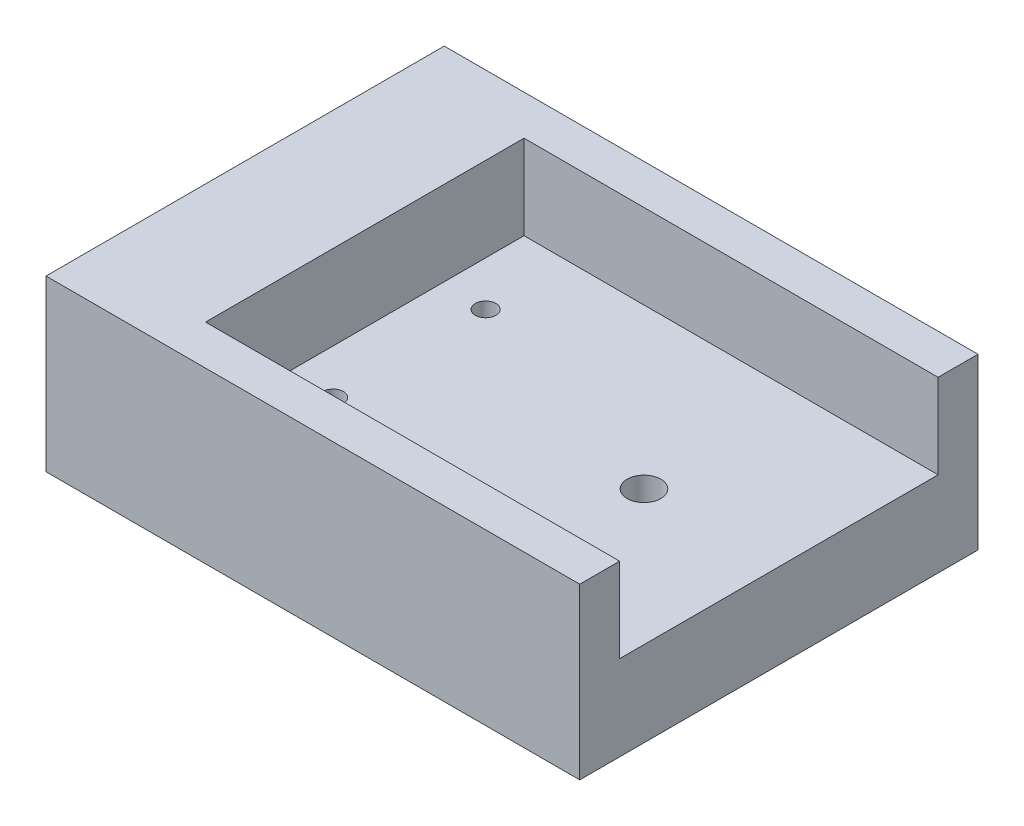
ISO-10303-21;
HEADER;
FILE_DESCRIPTION(('STEP AP214'),'2;1');
FILE_NAME('part.step','',(''),(''),'','','');
FILE_SCHEMA(('AUTOMOTIVE_DESIGN { 1 0 10303 214 1 1 1 1 }'));
ENDSEC;
DATA;
#1=APPLICATION_CONTEXT('core data for automotive mechanical design processes');
#2=APPLICATION_PROTOCOL_DEFINITION('international standard','automotive_design',2000,#1);
#3=PRODUCT_CONTEXT('',#1,'mechanical');
#4=PRODUCT('Part','Part','',(#3));
#5=PRODUCT_RELATED_PRODUCT_CATEGORY('part','',(#4));
#6=PRODUCT_DEFINITION_FORMATION('','',#4);
#7=PRODUCT_DEFINITION_CONTEXT('part definition',#1,'design');
#8=PRODUCT_DEFINITION('design','',#6,#7);
#9=PRODUCT_DEFINITION_SHAPE('','',#8);
#10=(LENGTH_UNIT() NAMED_UNIT(*) SI_UNIT(.MILLI.,.METRE.));
#11=(NAMED_UNIT(*) PLANE_ANGLE_UNIT() SI_UNIT($,.RADIAN.));
#12=(NAMED_UNIT(*) SI_UNIT($,.STERADIAN.) SOLID_ANGLE_UNIT());
#13=UNCERTAINTY_MEASURE_WITH_UNIT(LENGTH_MEASURE(1.E-05),#10,'distance_accuracy_value','');
#14=(GEOMETRIC_REPRESENTATION_CONTEXT(3) GLOBAL_UNCERTAINTY_ASSIGNED_CONTEXT((#13)) GLOBAL_UNIT_ASSIGNED_CONTEXT((#10,
#11,#12)) REPRESENTATION_CONTEXT('',''));
#15=CARTESIAN_POINT('',(0.,0.,0.));
#16=DIRECTION('',(0.,0.,1.));
#17=DIRECTION('',(1.,0.,0.));
#18=AXIS2_PLACEMENT_3D('',#15,#16,#17);
#19=CARTESIAN_POINT('',(45.5,28.9,-33.95));
#20=DIRECTION('',(-1.,0.,0.));
#21=DIRECTION('',(0.,0.,1.));
#22=AXIS2_PLACEMENT_3D('',#19,#20,#21);
#23=PLANE('',#22);
#24=DIRECTION('',(0.,0.,1.));
#25=VECTOR('',#24,1.);
#26=CARTESIAN_POINT('',(45.5,14.5,-27.15));
#27=LINE('',#26,#25);
#28=CARTESIAN_POINT('',(45.5,14.5,-27.15));
#29=VERTEX_POINT('',#28);
#30=CARTESIAN_POINT('',(45.5,14.5,27.15));
#31=VERTEX_POINT('',#30);
#32=EDGE_CURVE('E138',#29,#31,#27,.T.);
#33=ORIENTED_EDGE('',*,*,#32,.T.);
#34=DIRECTION('',(0.,1.,0.));
#35=VECTOR('',#34,1.);
#36=CARTESIAN_POINT('',(45.5,-89.0665481536138,27.15));
#37=LINE('',#36,#35);
#38=CARTESIAN_POINT('',(45.5,28.9,27.15));
#39=VERTEX_POINT('',#38);
#40=EDGE_CURVE('E130',#31,#39,#37,.T.);
#41=ORIENTED_EDGE('',*,*,#40,.T.);
#42=DIRECTION('',(0.,0.,-1.));
#43=VECTOR('',#42,1.);
#44=CARTESIAN_POINT('',(45.5,28.9,-33.95));
#45=LINE('',#44,#43);
#46=CARTESIAN_POINT('',(45.5,28.9,33.95));
#47=VERTEX_POINT('',#46);
#48=EDGE_CURVE('E139',#47,#39,#45,.T.);
#49=ORIENTED_EDGE('',*,*,#48,.F.);
#50=DIRECTION('',(0.,-1.,0.));
#51=VECTOR('',#50,1.);
#52=CARTESIAN_POINT('',(45.5,28.9,33.95));
#53=LINE('',#52,#51);
#54=CARTESIAN_POINT('',(45.5,0.,33.95));
#55=VERTEX_POINT('',#54);
#56=EDGE_CURVE('E146',#47,#55,#53,.T.);
#57=ORIENTED_EDGE('',*,*,#56,.T.);
#58=DIRECTION('',(0.,0.,-1.));
#59=VECTOR('',#58,1.);
#60=CARTESIAN_POINT('',(45.5,0.,-33.95));
#61=LINE('',#60,#59);
#62=CARTESIAN_POINT('',(45.5,0.,-33.95));
#63=VERTEX_POINT('',#62);
#64=EDGE_CURVE('E137',#55,#63,#61,.T.);
#65=ORIENTED_EDGE('',*,*,#64,.T.);
#66=DIRECTION('',(0.,-1.,0.));
#67=VECTOR('',#66,1.);
#68=CARTESIAN_POINT('',(45.5,28.9,-33.95));
#69=LINE('',#68,#67);
#70=CARTESIAN_POINT('',(45.5,28.9,-33.95));
#71=VERTEX_POINT('',#70);
#72=EDGE_CURVE('E12',#71,#63,#69,.T.);
#73=ORIENTED_EDGE('',*,*,#72,.F.);
#74=CARTESIAN_POINT('',(45.5,28.9,-27.15));
#75=VERTEX_POINT('',#74);
#76=EDGE_CURVE('E85',#75,#71,#45,.T.);
#77=ORIENTED_EDGE('',*,*,#76,.F.);
#78=DIRECTION('',(0.,1.,0.));
#79=VECTOR('',#78,1.);
#80=CARTESIAN_POINT('',(45.5,-89.0665481536138,-27.15));
#81=LINE('',#80,#79);
#82=EDGE_CURVE('E49',#29,#75,#81,.T.);
#83=ORIENTED_EDGE('',*,*,#82,.F.);
#84=EDGE_LOOP('',(#33,#41,#49,#57,#65,#73,#77,#83));
#85=FACE_BOUND('',#84,.T.);
#86=ADVANCED_FACE('F35',(#85),#23,.F.);
#87=CARTESIAN_POINT('',(-45.5,28.9,-33.95));
#88=DIRECTION('',(0.,0.,1.));
#89=DIRECTION('',(1.,0.,0.));
#90=AXIS2_PLACEMENT_3D('',#87,#88,#89);
#91=PLANE('',#90);
#92=DIRECTION('',(-1.,0.,0.));
#93=VECTOR('',#92,1.);
#94=CARTESIAN_POINT('',(-45.5,0.,-33.95));
#95=LINE('',#94,#93);
#96=CARTESIAN_POINT('',(-45.5,0.,-33.95));
#97=VERTEX_POINT('',#96);
#98=EDGE_CURVE('E149',#63,#97,#95,.T.);
#99=ORIENTED_EDGE('',*,*,#98,.T.);
#100=DIRECTION('',(0.,-1.,0.));
#101=VECTOR('',#100,1.);
#102=CARTESIAN_POINT('',(-45.5,28.9,-33.95));
#103=LINE('',#102,#101);
#104=CARTESIAN_POINT('',(-45.5,28.9,-33.95));
#105=VERTEX_POINT('',#104);
#106=EDGE_CURVE('E42',#105,#97,#103,.T.);
#107=ORIENTED_EDGE('',*,*,#106,.F.);
#108=DIRECTION('',(-1.,0.,0.));
#109=VECTOR('',#108,1.);
#110=CARTESIAN_POINT('',(-45.5,28.9,-33.95));
#111=LINE('',#110,#109);
#112=EDGE_CURVE('E141',#71,#105,#111,.T.);
#113=ORIENTED_EDGE('',*,*,#112,.F.);
#114=ORIENTED_EDGE('',*,*,#72,.T.);
#115=EDGE_LOOP('',(#99,#107,#113,#114));
#116=FACE_BOUND('',#115,.T.);
#117=ADVANCED_FACE('F179',(#116),#91,.F.);
#118=CARTESIAN_POINT('',(-45.5,28.9,-33.95));
#119=DIRECTION('',(1.,0.,0.));
#120=DIRECTION('',(0.,0.,-1.));
#121=AXIS2_PLACEMENT_3D('',#118,#119,#120);
#122=PLANE('',#121);
#123=CARTESIAN_POINT('',(-45.5,5.75039678785909,0.));
#124=DIRECTION('',(-1.,0.,0.));
#125=DIRECTION('',(0.,0.,1.));
#126=AXIS2_PLACEMENT_3D('',#123,#124,#125);
#127=CIRCLE('',#126,3.75);
#128=CARTESIAN_POINT('',(-45.5,5.75039678785909,3.75));
#129=VERTEX_POINT('',#128);
#130=EDGE_CURVE('E316',#129,#129,#127,.T.);
#131=ORIENTED_EDGE('',*,*,#130,.F.);
#132=EDGE_LOOP('',(#131));
#133=FACE_BOUND('',#132,.T.);
#134=DIRECTION('',(0.,0.,1.));
#135=VECTOR('',#134,1.);
#136=CARTESIAN_POINT('',(-45.5,0.,-33.95));
#137=LINE('',#136,#135);
#138=CARTESIAN_POINT('',(-45.5,0.,33.95));
#139=VERTEX_POINT('',#138);
#140=EDGE_CURVE('E151',#97,#139,#137,.T.);
#141=ORIENTED_EDGE('',*,*,#140,.T.);
#142=DIRECTION('',(0.,-1.,0.));
#143=VECTOR('',#142,1.);
#144=CARTESIAN_POINT('',(-45.5,28.9,33.95));
#145=LINE('',#144,#143);
#146=CARTESIAN_POINT('',(-45.5,28.9,33.95));
#147=VERTEX_POINT('',#146);
#148=EDGE_CURVE('E155',#147,#139,#145,.T.);
#149=ORIENTED_EDGE('',*,*,#148,.F.);
#150=DIRECTION('',(0.,0.,1.));
#151=VECTOR('',#150,1.);
#152=CARTESIAN_POINT('',(-45.5,28.9,-33.95));
#153=LINE('',#152,#151);
#154=EDGE_CURVE('E143',#105,#147,#153,.T.);
#155=ORIENTED_EDGE('',*,*,#154,.F.);
#156=ORIENTED_EDGE('',*,*,#106,.T.);
#157=EDGE_LOOP('',(#141,#149,#155,#156));
#158=FACE_BOUND('',#157,.T.);
#159=ADVANCED_FACE('F161',(#133,#158),#122,.F.);
#160=CARTESIAN_POINT('',(-45.5,28.9,33.95));
#161=DIRECTION('',(0.,0.,-1.));
#162=DIRECTION('',(-1.,0.,0.));
#163=AXIS2_PLACEMENT_3D('',#160,#161,#162);
#164=PLANE('',#163);
#165=DIRECTION('',(1.,0.,0.));
#166=VECTOR('',#165,1.);
#167=CARTESIAN_POINT('',(-45.5,0.,33.95));
#168=LINE('',#167,#166);
#169=EDGE_CURVE('E79',#139,#55,#168,.T.);
#170=ORIENTED_EDGE('',*,*,#169,.T.);
#171=ORIENTED_EDGE('',*,*,#56,.F.);
#172=DIRECTION('',(1.,0.,0.));
#173=VECTOR('',#172,1.);
#174=CARTESIAN_POINT('',(-45.5,28.9,33.95));
#175=LINE('',#174,#173);
#176=EDGE_CURVE('E58',#147,#47,#175,.T.);
#177=ORIENTED_EDGE('',*,*,#176,.F.);
#178=ORIENTED_EDGE('',*,*,#148,.T.);
#179=EDGE_LOOP('',(#170,#171,#177,#178));
#180=FACE_BOUND('',#179,.T.);
#181=ADVANCED_FACE('F171',(#180),#164,.F.);
#182=CARTESIAN_POINT('',(0.,28.9,0.));
#183=DIRECTION('',(0.,1.,0.));
#184=DIRECTION('',(0.,0.,1.));
#185=AXIS2_PLACEMENT_3D('',#182,#183,#184);
#186=PLANE('',#185);
#187=DIRECTION('',(1.,0.,0.));
#188=VECTOR('',#187,1.);
#189=CARTESIAN_POINT('',(-25.1,28.9,27.15));
#190=LINE('',#189,#188);
#191=CARTESIAN_POINT('',(-25.1,28.9,27.15));
#192=VERTEX_POINT('',#191);
#193=EDGE_CURVE('E125',#192,#39,#190,.T.);
#194=ORIENTED_EDGE('',*,*,#193,.F.);
#195=DIRECTION('',(0.,0.,1.));
#196=VECTOR('',#195,1.);
#197=CARTESIAN_POINT('',(-25.1,28.9,-27.15));
#198=LINE('',#197,#196);
#199=CARTESIAN_POINT('',(-25.1,28.9,-27.15));
#200=VERTEX_POINT('',#199);
#201=EDGE_CURVE('E113',#200,#192,#198,.T.);
#202=ORIENTED_EDGE('',*,*,#201,.F.);
#203=DIRECTION('',(-1.,0.,0.));
#204=VECTOR('',#203,1.);
#205=CARTESIAN_POINT('',(-25.1,28.9,-27.15));
#206=LINE('',#205,#204);
#207=EDGE_CURVE('E120',#75,#200,#206,.T.);
#208=ORIENTED_EDGE('',*,*,#207,.F.);
#209=ORIENTED_EDGE('',*,*,#76,.T.);
#210=ORIENTED_EDGE('',*,*,#112,.T.);
#211=ORIENTED_EDGE('',*,*,#154,.T.);
#212=ORIENTED_EDGE('',*,*,#176,.T.);
#213=ORIENTED_EDGE('',*,*,#48,.T.);
#214=EDGE_LOOP('',(#194,#202,#208,#209,#210,#211,#212,#213));
#215=FACE_BOUND('',#214,.T.);
#216=ADVANCED_FACE('F124',(#215),#186,.T.);
#217=CARTESIAN_POINT('',(0.,0.,0.));
#218=DIRECTION('',(0.,1.,0.));
#219=DIRECTION('',(0.,0.,1.));
#220=AXIS2_PLACEMENT_3D('',#217,#218,#219);
#221=PLANE('',#220);
#222=CARTESIAN_POINT('',(22.5,0.,0.));
#223=DIRECTION('',(0.,1.,0.));
#224=DIRECTION('',(0.,0.,1.));
#225=AXIS2_PLACEMENT_3D('',#222,#223,#224);
#226=CIRCLE('',#225,2.87151234494295);
#227=CARTESIAN_POINT('',(22.5,0.,2.87151234494295));
#228=VERTEX_POINT('',#227);
#229=EDGE_CURVE('E319',#228,#228,#226,.F.);
#230=ORIENTED_EDGE('',*,*,#229,.F.);
#231=EDGE_LOOP('',(#230));
#232=FACE_BOUND('',#231,.T.);
#233=CARTESIAN_POINT('',(-17.5,0.,-13.));
#234=DIRECTION('',(0.,1.,0.));
#235=DIRECTION('',(0.,0.,1.));
#236=AXIS2_PLACEMENT_3D('',#233,#234,#235);
#237=CIRCLE('',#236,1.75465885186677);
#238=CARTESIAN_POINT('',(-17.5,0.,-11.2453411481332));
#239=VERTEX_POINT('',#238);
#240=EDGE_CURVE('E329',#239,#239,#237,.F.);
#241=ORIENTED_EDGE('',*,*,#240,.F.);
#242=EDGE_LOOP('',(#241));
#243=FACE_BOUND('',#242,.T.);
#244=CARTESIAN_POINT('',(-17.5,0.,13.));
#245=DIRECTION('',(0.,1.,0.));
#246=DIRECTION('',(0.,0.,1.));
#247=AXIS2_PLACEMENT_3D('',#244,#245,#246);
#248=CIRCLE('',#247,1.75465885186677);
#249=CARTESIAN_POINT('',(-17.5,0.,14.7546588518668));
#250=VERTEX_POINT('',#249);
#251=EDGE_CURVE('E322',#250,#250,#248,.F.);
#252=ORIENTED_EDGE('',*,*,#251,.F.);
#253=EDGE_LOOP('',(#252));
#254=FACE_BOUND('',#253,.T.);
#255=ORIENTED_EDGE('',*,*,#64,.F.);
#256=ORIENTED_EDGE('',*,*,#169,.F.);
#257=ORIENTED_EDGE('',*,*,#140,.F.);
#258=ORIENTED_EDGE('',*,*,#98,.F.);
#259=EDGE_LOOP('',(#255,#256,#257,#258));
#260=FACE_BOUND('',#259,.T.);
#261=ADVANCED_FACE('F166',(#232,#243,#254,#260),#221,.F.);
#262=CARTESIAN_POINT('',(-25.1,-89.0665481536138,27.15));
#263=DIRECTION('',(0.,0.,1.));
#264=DIRECTION('',(1.,0.,0.));
#265=AXIS2_PLACEMENT_3D('',#262,#263,#264);
#266=PLANE('',#265);
#267=DIRECTION('',(-1.,0.,0.));
#268=VECTOR('',#267,1.);
#269=CARTESIAN_POINT('',(-25.1,14.5,27.15));
#270=LINE('',#269,#268);
#271=CARTESIAN_POINT('',(-25.1,14.5,27.15));
#272=VERTEX_POINT('',#271);
#273=EDGE_CURVE('E310',#31,#272,#270,.T.);
#274=ORIENTED_EDGE('',*,*,#273,.T.);
#275=DIRECTION('',(0.,1.,0.));
#276=VECTOR('',#275,1.);
#277=CARTESIAN_POINT('',(-25.1,-89.0665481536138,27.15));
#278=LINE('',#277,#276);
#279=EDGE_CURVE('E118',#272,#192,#278,.T.);
#280=ORIENTED_EDGE('',*,*,#279,.T.);
#281=ORIENTED_EDGE('',*,*,#193,.T.);
#282=ORIENTED_EDGE('',*,*,#40,.F.);
#283=EDGE_LOOP('',(#274,#280,#281,#282));
#284=FACE_BOUND('',#283,.T.);
#285=ADVANCED_FACE('F234',(#284),#266,.F.);
#286=CARTESIAN_POINT('',(-25.1,-89.0665481536138,-27.15));
#287=DIRECTION('',(-1.,0.,0.));
#288=DIRECTION('',(0.,0.,1.));
#289=AXIS2_PLACEMENT_3D('',#286,#287,#288);
#290=PLANE('',#289);
#291=DIRECTION('',(0.,0.,-1.));
#292=VECTOR('',#291,1.);
#293=CARTESIAN_POINT('',(-25.1,14.5,-27.15));
#294=LINE('',#293,#292);
#295=CARTESIAN_POINT('',(-25.1,14.5,-27.15));
#296=VERTEX_POINT('',#295);
#297=EDGE_CURVE('E116',#272,#296,#294,.T.);
#298=ORIENTED_EDGE('',*,*,#297,.T.);
#299=DIRECTION('',(0.,1.,0.));
#300=VECTOR('',#299,1.);
#301=CARTESIAN_POINT('',(-25.1,-89.0665481536138,-27.15));
#302=LINE('',#301,#300);
#303=EDGE_CURVE('E109',#296,#200,#302,.T.);
#304=ORIENTED_EDGE('',*,*,#303,.T.);
#305=ORIENTED_EDGE('',*,*,#201,.T.);
#306=ORIENTED_EDGE('',*,*,#279,.F.);
#307=EDGE_LOOP('',(#298,#304,#305,#306));
#308=FACE_BOUND('',#307,.T.);
#309=ADVANCED_FACE('F110',(#308),#290,.F.);
#310=CARTESIAN_POINT('',(-25.1,-89.0665481536138,-27.15));
#311=DIRECTION('',(0.,0.,-1.));
#312=DIRECTION('',(-1.,0.,0.));
#313=AXIS2_PLACEMENT_3D('',#310,#311,#312);
#314=PLANE('',#313);
#315=DIRECTION('',(1.,0.,0.));
#316=VECTOR('',#315,1.);
#317=CARTESIAN_POINT('',(-25.1,14.5,-27.15));
#318=LINE('',#317,#316);
#319=EDGE_CURVE('E135',#296,#29,#318,.T.);
#320=ORIENTED_EDGE('',*,*,#319,.T.);
#321=ORIENTED_EDGE('',*,*,#82,.T.);
#322=ORIENTED_EDGE('',*,*,#207,.T.);
#323=ORIENTED_EDGE('',*,*,#303,.F.);
#324=EDGE_LOOP('',(#320,#321,#322,#323));
#325=FACE_BOUND('',#324,.T.);
#326=ADVANCED_FACE('F121',(#325),#314,.F.);
#327=CARTESIAN_POINT('',(0.,14.5,0.));
#328=DIRECTION('',(0.,1.,0.));
#329=DIRECTION('',(0.,0.,1.));
#330=AXIS2_PLACEMENT_3D('',#327,#328,#329);
#331=PLANE('',#330);
#332=CARTESIAN_POINT('',(22.5,14.5,0.));
#333=DIRECTION('',(0.,1.,0.));
#334=DIRECTION('',(0.,0.,1.));
#335=AXIS2_PLACEMENT_3D('',#332,#333,#334);
#336=CIRCLE('',#335,2.87151234494295);
#337=CARTESIAN_POINT('',(22.5,14.5,2.87151234494295));
#338=VERTEX_POINT('',#337);
#339=EDGE_CURVE('E332',#338,#338,#336,.T.);
#340=ORIENTED_EDGE('',*,*,#339,.F.);
#341=EDGE_LOOP('',(#340));
#342=FACE_BOUND('',#341,.T.);
#343=CARTESIAN_POINT('',(-17.5,14.5,-13.));
#344=DIRECTION('',(0.,1.,0.));
#345=DIRECTION('',(0.,0.,1.));
#346=AXIS2_PLACEMENT_3D('',#343,#344,#345);
#347=CIRCLE('',#346,1.75465885186677);
#348=CARTESIAN_POINT('',(-17.5,14.5,-11.2453411481332));
#349=VERTEX_POINT('',#348);
#350=EDGE_CURVE('E325',#349,#349,#347,.T.);
#351=ORIENTED_EDGE('',*,*,#350,.F.);
#352=EDGE_LOOP('',(#351));
#353=FACE_BOUND('',#352,.T.);
#354=CARTESIAN_POINT('',(-17.5,14.5,13.));
#355=DIRECTION('',(0.,1.,0.));
#356=DIRECTION('',(0.,0.,-1.));
#357=AXIS2_PLACEMENT_3D('',#354,#355,#356);
#358=CIRCLE('',#357,1.75465885186677);
#359=CARTESIAN_POINT('',(-17.5,14.5,11.2453411481332));
#360=VERTEX_POINT('',#359);
#361=EDGE_CURVE('E326',#360,#360,#358,.T.);
#362=ORIENTED_EDGE('',*,*,#361,.F.);
#363=EDGE_LOOP('',(#362));
#364=FACE_BOUND('',#363,.T.);
#365=ORIENTED_EDGE('',*,*,#32,.F.);
#366=ORIENTED_EDGE('',*,*,#319,.F.);
#367=ORIENTED_EDGE('',*,*,#297,.F.);
#368=ORIENTED_EDGE('',*,*,#273,.F.);
#369=EDGE_LOOP('',(#365,#366,#367,#368));
#370=FACE_BOUND('',#369,.T.);
#371=ADVANCED_FACE('F210',(#342,#353,#364,#370),#331,.T.);
#372=CARTESIAN_POINT('',(-40.5,5.75039678785909,0.));
#373=DIRECTION('',(-1.,0.,0.));
#374=DIRECTION('',(0.,0.,1.));
#375=AXIS2_PLACEMENT_3D('',#372,#373,#374);
#376=CYLINDRICAL_SURFACE('',#375,3.75);
#377=CARTESIAN_POINT('',(-40.5,5.75039678785909,0.));
#378=DIRECTION('',(-1.,0.,0.));
#379=DIRECTION('',(0.,0.,1.));
#380=AXIS2_PLACEMENT_3D('',#377,#378,#379);
#381=CIRCLE('',#380,3.75);
#382=CARTESIAN_POINT('',(-40.5,5.75039678785909,3.75));
#383=VERTEX_POINT('',#382);
#384=EDGE_CURVE('E122',#383,#383,#381,.T.);
#385=ORIENTED_EDGE('',*,*,#384,.F.);
#386=EDGE_LOOP('',(#385));
#387=FACE_BOUND('',#386,.T.);
#388=ORIENTED_EDGE('',*,*,#130,.T.);
#389=EDGE_LOOP('',(#388));
#390=FACE_BOUND('',#389,.T.);
#391=ADVANCED_FACE('F204',(#387,#390),#376,.F.);
#392=CARTESIAN_POINT('',(-40.5,5.75039678785909,0.));
#393=DIRECTION('',(-1.,0.,0.));
#394=DIRECTION('',(0.,0.,1.));
#395=AXIS2_PLACEMENT_3D('',#392,#393,#394);
#396=PLANE('',#395);
#397=ORIENTED_EDGE('',*,*,#384,.T.);
#398=EDGE_LOOP('',(#397));
#399=FACE_BOUND('',#398,.T.);
#400=ADVANCED_FACE('F209',(#399),#396,.T.);
#401=CARTESIAN_POINT('',(-17.5,-8.12186340548018,13.));
#402=DIRECTION('',(0.,1.,0.));
#403=DIRECTION('',(0.,0.,1.));
#404=AXIS2_PLACEMENT_3D('',#401,#402,#403);
#405=CYLINDRICAL_SURFACE('',#404,1.75465885186677);
#406=ORIENTED_EDGE('',*,*,#251,.T.);
#407=EDGE_LOOP('',(#406));
#408=FACE_BOUND('',#407,.T.);
#409=ORIENTED_EDGE('',*,*,#361,.T.);
#410=EDGE_LOOP('',(#409));
#411=FACE_BOUND('',#410,.T.);
#412=ADVANCED_FACE('F222',(#408,#411),#405,.F.);
#413=CARTESIAN_POINT('',(-17.5,-8.12186340548018,-13.));
#414=DIRECTION('',(0.,1.,0.));
#415=DIRECTION('',(0.,0.,1.));
#416=AXIS2_PLACEMENT_3D('',#413,#414,#415);
#417=CYLINDRICAL_SURFACE('',#416,1.75465885186677);
#418=ORIENTED_EDGE('',*,*,#240,.T.);
#419=EDGE_LOOP('',(#418));
#420=FACE_BOUND('',#419,.T.);
#421=ORIENTED_EDGE('',*,*,#350,.T.);
#422=EDGE_LOOP('',(#421));
#423=FACE_BOUND('',#422,.T.);
#424=ADVANCED_FACE('F251',(#420,#423),#417,.F.);
#425=CARTESIAN_POINT('',(22.5,-8.12186340548018,0.));
#426=DIRECTION('',(0.,1.,0.));
#427=DIRECTION('',(0.,0.,1.));
#428=AXIS2_PLACEMENT_3D('',#425,#426,#427);
#429=CYLINDRICAL_SURFACE('',#428,2.87151234494295);
#430=ORIENTED_EDGE('',*,*,#229,.T.);
#431=EDGE_LOOP('',(#430));
#432=FACE_BOUND('',#431,.T.);
#433=ORIENTED_EDGE('',*,*,#339,.T.);
#434=EDGE_LOOP('',(#433));
#435=FACE_BOUND('',#434,.T.);
#436=ADVANCED_FACE('F261',(#432,#435),#429,.F.);
#437=CLOSED_SHELL('',(#86,#117,#159,#181,#216,#261,#285,#309,#326,#371,#391,#400,#412,#424,#436));
#438=MANIFOLD_SOLID_BREP('B2',#437);
#439=ADVANCED_BREP_SHAPE_REPRESENTATION('',(#18,#438),#14);
#440=SHAPE_DEFINITION_REPRESENTATION(#9,#439);
ENDSEC;
END-ISO-10303-21;
